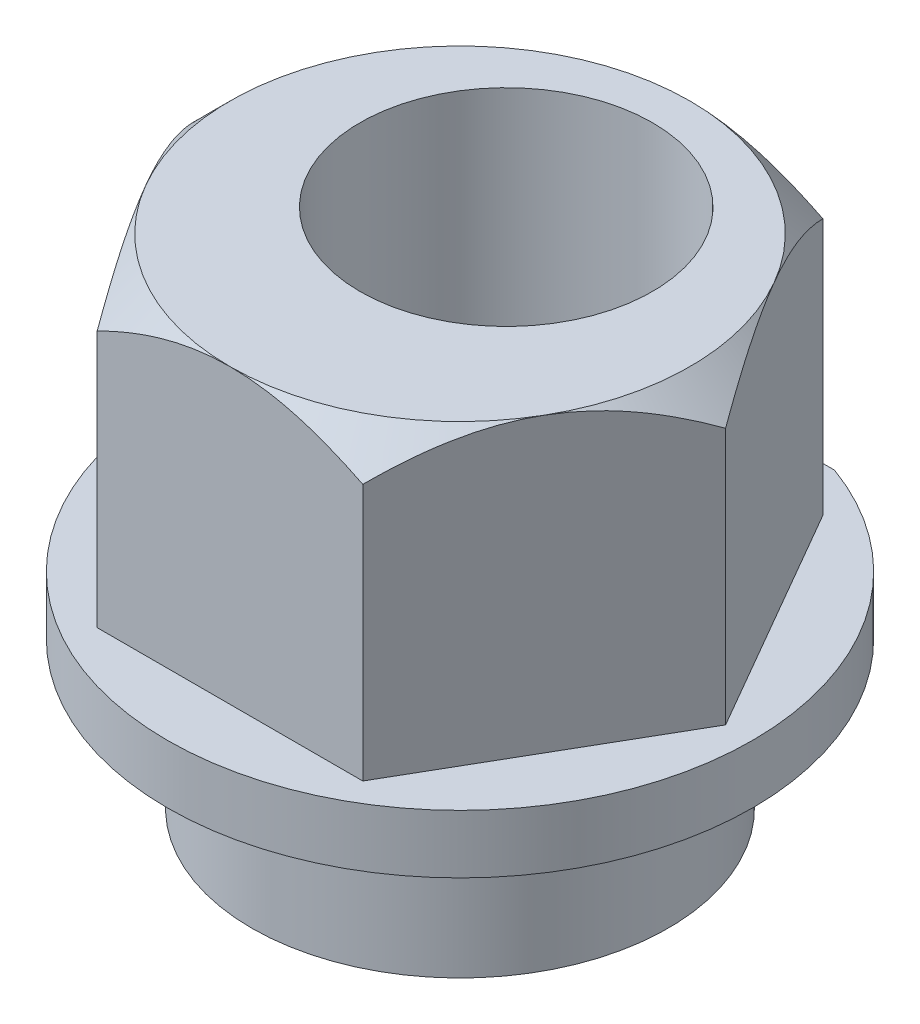
ISO-10303-21;
HEADER;
FILE_DESCRIPTION(('STEP AP214'),'2;1');
FILE_NAME('part.step','',(''),(''),'','','');
FILE_SCHEMA(('AUTOMOTIVE_DESIGN { 1 0 10303 214 1 1 1 1 }'));
ENDSEC;
DATA;
#1=APPLICATION_CONTEXT('core data for automotive mechanical design processes');
#2=APPLICATION_PROTOCOL_DEFINITION('international standard','automotive_design',2000,#1);
#3=PRODUCT_CONTEXT('',#1,'mechanical');
#4=PRODUCT('Part','Part','',(#3));
#5=PRODUCT_RELATED_PRODUCT_CATEGORY('part','',(#4));
#6=PRODUCT_DEFINITION_FORMATION('','',#4);
#7=PRODUCT_DEFINITION_CONTEXT('part definition',#1,'design');
#8=PRODUCT_DEFINITION('design','',#6,#7);
#9=PRODUCT_DEFINITION_SHAPE('','',#8);
#10=(LENGTH_UNIT() NAMED_UNIT(*) SI_UNIT(.MILLI.,.METRE.));
#11=(NAMED_UNIT(*) PLANE_ANGLE_UNIT() SI_UNIT($,.RADIAN.));
#12=(NAMED_UNIT(*) SI_UNIT($,.STERADIAN.) SOLID_ANGLE_UNIT());
#13=UNCERTAINTY_MEASURE_WITH_UNIT(LENGTH_MEASURE(1.E-05),#10,'distance_accuracy_value','');
#14=(GEOMETRIC_REPRESENTATION_CONTEXT(3) GLOBAL_UNCERTAINTY_ASSIGNED_CONTEXT((#13)) GLOBAL_UNIT_ASSIGNED_CONTEXT((#10,
#11,#12)) REPRESENTATION_CONTEXT('',''));
#15=CARTESIAN_POINT('',(0.,0.,0.));
#16=DIRECTION('',(0.,0.,1.));
#17=DIRECTION('',(1.,0.,0.));
#18=AXIS2_PLACEMENT_3D('',#15,#16,#17);
#19=CARTESIAN_POINT('',(-2.27,5.,3.93175533318135));
#20=DIRECTION('',(0.,0.,-1.));
#21=DIRECTION('',(-1.,0.,0.));
#22=AXIS2_PLACEMENT_3D('',#19,#20,#21);
#23=PLANE('',#22);
#24=CARTESIAN_POINT('',(-8.6000228190224,-0.52441156930644,3.93175533318135));
#25=CARTESIAN_POINT('',(-8.47417106777818,-0.409956632713431,3.93175533318135));
#26=CARTESIAN_POINT('',(-8.34810563347453,-0.295736516617883,3.93175533318135));
#27=CARTESIAN_POINT('',(-8.09548697362164,-0.067835354493157,3.93175533318135));
#28=CARTESIAN_POINT('',(-7.96893374476789,0.0458456878724306,3.93175533318135));
#29=CARTESIAN_POINT('',(-7.58838821070913,0.386032807600535,3.93175533318135));
#30=CARTESIAN_POINT('',(-7.33357557116019,0.611623167377675,3.93175533318135));
#31=CARTESIAN_POINT('',(-6.81909396892371,1.06137010956859,3.93175533318135));
#32=CARTESIAN_POINT('',(-6.559402504075,1.28550104064094,3.93175533318135));
#33=CARTESIAN_POINT('',(-6.16703874408497,1.61832234982298,3.93175533318135));
#34=CARTESIAN_POINT('',(-6.03579055665889,1.72869140219158,3.93175533318135));
#35=CARTESIAN_POINT('',(-5.77217570198827,1.94810480433376,3.93175533318135));
#36=CARTESIAN_POINT('',(-5.63980895815953,2.05714906213602,3.93175533318135));
#37=CARTESIAN_POINT('',(-5.27682294674642,2.35257326765163,3.93175533318135));
#38=CARTESIAN_POINT('',(-5.04492002178482,2.53738265563553,3.93175533318135));
#39=CARTESIAN_POINT('',(-4.57603688836875,2.90044445388261,3.93175533318135));
#40=CARTESIAN_POINT('',(-4.33905733460263,3.07869770167396,3.93175533318135));
#41=CARTESIAN_POINT('',(-3.97858782063124,3.33881167671325,3.93175533318135));
#42=CARTESIAN_POINT('',(-3.85768113299005,3.42425020260504,3.93175533318135));
#43=CARTESIAN_POINT('',(-3.6138570073651,3.59220177558191,3.93175533318135));
#44=CARTESIAN_POINT('',(-3.49093969824627,3.67471500908981,3.93175533318135));
#45=CARTESIAN_POINT('',(-3.24282085576494,3.83609884951887,3.93175533318135));
#46=CARTESIAN_POINT('',(-3.11762059941351,3.91497141069697,3.93175533318135));
#47=CARTESIAN_POINT('',(-2.86450980866584,4.06822123349522,3.93175533318135));
#48=CARTESIAN_POINT('',(-2.73659960513852,4.14259903967573,3.93175533318135));
#49=CARTESIAN_POINT('',(-2.48244869682101,4.28304915421703,3.93175533318135));
#50=CARTESIAN_POINT('',(-2.35632351206864,4.34932771771606,3.93175533318135));
#51=CARTESIAN_POINT('',(-2.10086334606727,4.47530499379159,3.93175533318135));
#52=CARTESIAN_POINT('',(-1.97152808762356,4.53500313569987,3.93175533318135));
#53=CARTESIAN_POINT('',(-1.57855460896811,4.70157038256315,3.93175533318135));
#54=CARTESIAN_POINT('',(-1.30928799909616,4.79629643602965,3.93175533318135));
#55=CARTESIAN_POINT('',(-0.921004184798862,4.89504627083465,3.93175533318135));
#56=CARTESIAN_POINT('',(-0.807116545249139,4.91960458592334,3.93175533318135));
#57=CARTESIAN_POINT('',(-0.577700200999931,4.95938872404308,3.93175533318135));
#58=CARTESIAN_POINT('',(-0.462171734875598,4.97461588988773,3.93175533318135));
#59=CARTESIAN_POINT('',(-0.230427594292592,4.99494178849449,3.93175533318135));
#60=CARTESIAN_POINT('',(-0.114213532543297,5.00005871608539,3.93175533318135));
#61=CARTESIAN_POINT('',(0.118212892903144,4.99994026687985,3.93175533318135));
#62=CARTESIAN_POINT('',(0.2344252565134,4.99470467271188,3.93175533318135));
#63=CARTESIAN_POINT('',(0.465576669831557,4.97420007502702,3.93175533318135));
#64=CARTESIAN_POINT('',(0.580518583181538,4.95896283721783,3.93175533318135));
#65=CARTESIAN_POINT('',(0.808800558806269,4.91924835621947,3.93175533318135));
#66=CARTESIAN_POINT('',(0.922140227239552,4.89476888083797,3.93175533318135));
#67=CARTESIAN_POINT('',(1.14699786229447,4.83755907255013,3.93175533318135));
#68=CARTESIAN_POINT('',(1.25851050271048,4.8048080494106,3.93175533318135));
#69=CARTESIAN_POINT('',(1.47918212486924,4.73225313837454,3.93175533318135));
#70=CARTESIAN_POINT('',(1.58834125329539,4.69244969145623,3.93175533318135));
#71=CARTESIAN_POINT('',(1.84761978249406,4.58974204356342,3.93175533318135));
#72=CARTESIAN_POINT('',(1.99660202130106,4.52397664260728,3.93175533318135));
#73=CARTESIAN_POINT('',(2.29027355478252,4.38341308938864,3.93175533318135));
#74=CARTESIAN_POINT('',(2.4349604334732,4.30860996931115,3.93175533318135));
#75=CARTESIAN_POINT('',(2.72080385407516,4.15188493932014,3.93175533318135));
#76=CARTESIAN_POINT('',(2.86195207579064,4.06994796974723,3.93175533318135));
#77=CARTESIAN_POINT('',(3.14091491185587,3.90067575359155,3.93175533318135));
#78=CARTESIAN_POINT('',(3.27873013377743,3.81334150135673,3.93175533318135));
#79=CARTESIAN_POINT('',(3.55298748118888,3.63349193541909,3.93175533318135));
#80=CARTESIAN_POINT('',(3.68940023095779,3.54093203481817,3.93175533318135));
#81=CARTESIAN_POINT('',(3.95982446284388,3.352371777699,3.93175533318135));
#82=CARTESIAN_POINT('',(4.09383586233152,3.25637130313162,3.93175533318135));
#83=CARTESIAN_POINT('',(4.35966651471137,3.06172891512756,3.93175533318135));
#84=CARTESIAN_POINT('',(4.49148827144601,2.96309041174252,3.93175533318135));
#85=CARTESIAN_POINT('',(4.75342283714005,2.7635680512874,3.93175533318135));
#86=CARTESIAN_POINT('',(4.88353560122586,2.66268413544546,3.93175533318135));
#87=CARTESIAN_POINT('',(5.1701453302912,2.43716714719451,3.93175533318135));
#88=CARTESIAN_POINT('',(5.32629592127036,2.3120943632501,3.93175533318135));
#89=CARTESIAN_POINT('',(5.63681960255552,2.05976325431522,3.93175533318135));
#90=CARTESIAN_POINT('',(5.79119267116417,1.93250490269373,3.93175533318135));
#91=CARTESIAN_POINT('',(6.25223154071247,1.54797710224199,3.93175533318135));
#92=CARTESIAN_POINT('',(6.55668696847647,1.28805839421696,3.93175533318135));
#93=CARTESIAN_POINT('',(7.15261464892951,0.771031249651298,3.93175533318135));
#94=CARTESIAN_POINT('',(7.44420710799032,0.514060583881735,3.93175533318135));
#95=CARTESIAN_POINT('',(7.879284428493,0.126215357984937,3.93175533318135));
#96=CARTESIAN_POINT('',(8.02387632548026,-0.00342021657362475,3.93175533318135));
#97=CARTESIAN_POINT('',(8.31241220611582,-0.263406206774195,3.93175533318135));
#98=CARTESIAN_POINT('',(8.45635619954871,-0.393756611554496,3.93175533318135));
#99=CARTESIAN_POINT('',(8.6000228190224,-0.524411569306441,3.93175533318135));
#100=B_SPLINE_CURVE_WITH_KNOTS('',3,(#24,#25,#26,#27,#28,#29,#30,#31,#32,#33,#34,#35,#36,#37,
#38,#39,#40,#41,#42,#43,#44,#45,#46,#47,#48,#49,#50,#51,#52,#53,#54,#55,#56,#57,#58,#59,#60,#61,
#62,#63,#64,#65,#66,#67,#68,#69,#70,#71,#72,#73,#74,#75,#76,#77,#78,#79,#80,#81,#82,#83,#84,#85,
#86,#87,#88,#89,#90,#91,#92,#93,#94,#95,#96,#97,#98,#99),.UNSPECIFIED.,.F.,.F.,(4,2,2,2,2,2,2,2,
2,2,2,2,2,2,2,2,2,2,2,2,2,2,2,2,2,2,2,2,2,2,2,2,2,2,2,2,2,4),(0.,0.510340114774654,
1.02068369290719,2.04163676290728,3.07070538013727,3.58515572785447,4.09964158852796,
4.9891730747215,5.8785905283064,6.32270092984362,6.76678297808562,7.21062380982803,
7.65441075994523,8.08165392177927,8.50893410595085,9.36121192377472,9.7104169009407,
10.0595716134115,10.4080973973259,10.7566304993015,11.1040619647595,11.4515773958677,
11.7999708546058,12.1483425364702,12.636481032208,13.1248890771091,13.6143543887469,
14.1037297928704,14.5982165343626,15.0927202584065,15.5866130208688,16.0805187258154,
16.680689529546,17.2808676515222,18.4817223275855,19.6476860099929,20.2302728035723,
20.812850769251),.UNSPECIFIED.);
#101=CARTESIAN_POINT('',(-2.27,4.39175533318135,3.93175533318135));
#102=VERTEX_POINT('',#101);
#103=CARTESIAN_POINT('',(0.,5.,3.93175533318135));
#104=VERTEX_POINT('',#103);
#105=EDGE_CURVE('E270',#102,#104,#100,.T.);
#106=ORIENTED_EDGE('',*,*,#105,.F.);
#107=DIRECTION('',(0.,-1.,0.));
#108=VECTOR('',#107,1.);
#109=CARTESIAN_POINT('',(-2.27,5.,3.93175533318135));
#110=LINE('',#109,#108);
#111=CARTESIAN_POINT('',(-2.27,0.,3.93175533318135));
#112=VERTEX_POINT('',#111);
#113=EDGE_CURVE('E255',#102,#112,#110,.T.);
#114=ORIENTED_EDGE('',*,*,#113,.T.);
#115=DIRECTION('',(1.,0.,0.));
#116=VECTOR('',#115,1.);
#117=CARTESIAN_POINT('',(-2.27,0.,3.93175533318135));
#118=LINE('',#117,#116);
#119=CARTESIAN_POINT('',(2.27,0.,3.93175533318135));
#120=VERTEX_POINT('',#119);
#121=EDGE_CURVE('E241',#112,#120,#118,.T.);
#122=ORIENTED_EDGE('',*,*,#121,.T.);
#123=DIRECTION('',(0.,-1.,0.));
#124=VECTOR('',#123,1.);
#125=CARTESIAN_POINT('',(2.27,5.,3.93175533318135));
#126=LINE('',#125,#124);
#127=CARTESIAN_POINT('',(2.27,4.39175533318136,3.93175533318135));
#128=VERTEX_POINT('',#127);
#129=EDGE_CURVE('E234',#128,#120,#126,.T.);
#130=ORIENTED_EDGE('',*,*,#129,.F.);
#131=EDGE_CURVE('E184',#104,#128,#100,.T.);
#132=ORIENTED_EDGE('',*,*,#131,.F.);
#133=EDGE_LOOP('',(#106,#114,#122,#130,#132));
#134=FACE_BOUND('',#133,.T.);
#135=ADVANCED_FACE('F42',(#134),#23,.F.);
#136=CARTESIAN_POINT('',(2.27,5.,3.93175533318135));
#137=DIRECTION('',(-0.866025403784439,0.,-0.5));
#138=DIRECTION('',(-0.5,0.,0.866025403784439));
#139=AXIS2_PLACEMENT_3D('',#136,#137,#138);
#140=PLANE('',#139);
#141=CARTESIAN_POINT('',(2.26988452994616,4.39163985872234,3.93195533318135));
#142=CARTESIAN_POINT('',(2.30891779817269,4.43066914607537,3.86434772942754));
#143=CARTESIAN_POINT('',(2.3482497625114,4.46850103601362,3.79622276883141));
#144=CARTESIAN_POINT('',(2.42757261255264,4.54140502992725,3.65883156235882));
#145=CARTESIAN_POINT('',(2.4675638439363,4.57647562653022,3.58956471774506));
#146=CARTESIAN_POINT('',(2.58899032257584,4.67729708736094,3.37924788735722));
#147=CARTESIAN_POINT('',(2.67145757452428,4.73822745605922,3.23641041702193));
#148=CARTESIAN_POINT('',(2.8377271512729,4.84257387561604,2.94842306234035));
#149=CARTESIAN_POINT('',(2.92148747729008,4.88625269544597,2.80334592202006));
#150=CARTESIAN_POINT('',(3.0908576914781,4.95355482963988,2.50998810575759));
#151=CARTESIAN_POINT('',(3.17646239246894,4.97722835735248,2.36171641427471));
#152=CARTESIAN_POINT('',(3.32399861844126,4.9985874545903,2.10617617493368));
#153=CARTESIAN_POINT('',(3.38574005738043,5.00174857485958,1.99923686575862));
#154=CARTESIAN_POINT('',(3.50912272596991,4.99641996417006,1.78553181498822));
#155=CARTESIAN_POINT('',(3.57076391290883,4.98792614894984,1.67876614737116));
#156=CARTESIAN_POINT('',(3.69346222484401,4.95977214735853,1.46624643709649));
#157=CARTESIAN_POINT('',(3.75451861880206,4.94009947200418,1.36049366063421));
#158=CARTESIAN_POINT('',(3.87558279707033,4.89066164453293,1.15080435289699));
#159=CARTESIAN_POINT('',(3.93559066140872,4.86089726622646,1.04686768300919));
#160=CARTESIAN_POINT('',(4.04211925292121,4.79966000814883,0.862354750050812));
#161=CARTESIAN_POINT('',(4.08887583057235,4.76979718890661,0.781369981970992));
#162=CARTESIAN_POINT('',(4.181549617169,4.7052589145889,0.620854275055807));
#163=CARTESIAN_POINT('',(4.227466800528,4.67058331308562,0.54132338053756));
#164=CARTESIAN_POINT('',(4.31831713258542,4.59719681770693,0.383965989529596));
#165=CARTESIAN_POINT('',(4.363252865234,4.55849861315991,0.30613501750693));
#166=CARTESIAN_POINT('',(4.45229216959135,4.4775750802213,0.151914418489406));
#167=CARTESIAN_POINT('',(4.49639623177315,4.43535191582271,0.0755239419703531));
#168=CARTESIAN_POINT('',(4.54011547005384,4.39163985872235,-0.000200000000002201));
#169=B_SPLINE_CURVE_WITH_KNOTS('',3,(#141,#142,#143,#144,#145,#146,#147,#148,#149,#150,#151,
#152,#153,#154,#155,#156,#157,#158,#159,#160,#161,#162,#163,#164,#165,#166,#167,#168),
.UNSPECIFIED.,.F.,.F.,(4,2,2,2,2,2,2,2,2,2,2,2,2,4),(0.,0.261817982395265,0.523777912649391,
1.05052627551642,1.56890964841258,2.08598797962916,2.45603524911659,2.82621222810196,
3.19680358288644,3.56736652793413,3.86172547652692,4.15609338288718,4.44955936991257,
4.74284650296531),.UNSPECIFIED.);
#170=CARTESIAN_POINT('',(3.405,5.,1.96587766659067));
#171=VERTEX_POINT('',#170);
#172=EDGE_CURVE('E231',#128,#171,#169,.T.);
#173=ORIENTED_EDGE('',*,*,#172,.F.);
#174=ORIENTED_EDGE('',*,*,#129,.T.);
#175=DIRECTION('',(0.5,0.,-0.866025403784439));
#176=VECTOR('',#175,1.);
#177=CARTESIAN_POINT('',(2.27,0.,3.93175533318135));
#178=LINE('',#177,#176);
#179=CARTESIAN_POINT('',(4.54,0.,0.));
#180=VERTEX_POINT('',#179);
#181=EDGE_CURVE('E269',#120,#180,#178,.T.);
#182=ORIENTED_EDGE('',*,*,#181,.T.);
#183=DIRECTION('',(0.,-1.,0.));
#184=VECTOR('',#183,1.);
#185=CARTESIAN_POINT('',(4.54,5.,0.));
#186=LINE('',#185,#184);
#187=CARTESIAN_POINT('',(4.54,4.39175533318136,0.));
#188=VERTEX_POINT('',#187);
#189=EDGE_CURVE('E242',#188,#180,#186,.T.);
#190=ORIENTED_EDGE('',*,*,#189,.F.);
#191=EDGE_CURVE('E209',#171,#188,#169,.T.);
#192=ORIENTED_EDGE('',*,*,#191,.F.);
#193=EDGE_LOOP('',(#173,#174,#182,#190,#192));
#194=FACE_BOUND('',#193,.T.);
#195=ADVANCED_FACE('F218',(#194),#140,.F.);
#196=CARTESIAN_POINT('',(4.54,5.,0.));
#197=DIRECTION('',(-0.866025403784438,0.,0.5));
#198=DIRECTION('',(0.5,0.,0.866025403784438));
#199=AXIS2_PLACEMENT_3D('',#196,#197,#198);
#200=PLANE('',#199);
#201=CARTESIAN_POINT('',(4.54011547005384,4.39163985872235,0.000199999999997449));
#202=CARTESIAN_POINT('',(4.50108220182731,4.43066914607537,-0.0674076037538108));
#203=CARTESIAN_POINT('',(4.4617502374886,4.46850103601362,-0.135532564349939));
#204=CARTESIAN_POINT('',(4.38242738744736,4.54140502992725,-0.272923770822536));
#205=CARTESIAN_POINT('',(4.34243615606369,4.57647562653022,-0.342190615436288));
#206=CARTESIAN_POINT('',(4.22100967742416,4.67729708736094,-0.552507445824137));
#207=CARTESIAN_POINT('',(4.13854242547572,4.73822745605922,-0.695344916159422));
#208=CARTESIAN_POINT('',(3.9722728487271,4.84257387561604,-0.983332270841005));
#209=CARTESIAN_POINT('',(3.88851252270992,4.88625269544597,-1.12840941116129));
#210=CARTESIAN_POINT('',(3.7191423085219,4.95355482963988,-1.42176722742376));
#211=CARTESIAN_POINT('',(3.63353760753106,4.97722835735248,-1.57003891890664));
#212=CARTESIAN_POINT('',(3.48600138155874,4.9985874545903,-1.82557915824767));
#213=CARTESIAN_POINT('',(3.42425994261956,5.00174857485958,-1.93251846742273));
#214=CARTESIAN_POINT('',(3.30087727403009,4.99641996417006,-2.14622351819313));
#215=CARTESIAN_POINT('',(3.23923608709117,4.98792614894984,-2.25298918581019));
#216=CARTESIAN_POINT('',(3.11653777515599,4.95977214735853,-2.46550889608486));
#217=CARTESIAN_POINT('',(3.05548138119794,4.94009947200418,-2.57126167254714));
#218=CARTESIAN_POINT('',(2.93441720292967,4.89066164453293,-2.78095098028436));
#219=CARTESIAN_POINT('',(2.87440933859128,4.86089726622646,-2.88488765017216));
#220=CARTESIAN_POINT('',(2.76788074707879,4.79966000814882,-3.06940058313054));
#221=CARTESIAN_POINT('',(2.72112416942764,4.76979718890661,-3.15038535121036));
#222=CARTESIAN_POINT('',(2.628450382831,4.7052589145889,-3.31090105812554));
#223=CARTESIAN_POINT('',(2.582533199472,4.67058331308562,-3.39043195264379));
#224=CARTESIAN_POINT('',(2.49168286741457,4.59719681770693,-3.54778934365175));
#225=CARTESIAN_POINT('',(2.446747134766,4.55849861315991,-3.62562031567442));
#226=CARTESIAN_POINT('',(2.35770783040864,4.4775750802213,-3.77984091469194));
#227=CARTESIAN_POINT('',(2.31360376822684,4.43535191582271,-3.856231391211));
#228=CARTESIAN_POINT('',(2.26988452994616,4.39163985872234,-3.93195533318135));
#229=B_SPLINE_CURVE_WITH_KNOTS('',3,(#201,#202,#203,#204,#205,#206,#207,#208,#209,#210,#211,
#212,#213,#214,#215,#216,#217,#218,#219,#220,#221,#222,#223,#224,#225,#226,#227,#228),
.UNSPECIFIED.,.F.,.F.,(4,2,2,2,2,2,2,2,2,2,2,2,2,4),(0.,0.261817982395265,0.523777912649389,
1.05052627551642,1.56890964841258,2.08598797962916,2.45603524911659,2.82621222810196,
3.19680358288644,3.56736652793412,3.86172547652692,4.15609338288718,4.44955936991257,
4.74284650296531),.UNSPECIFIED.);
#230=CARTESIAN_POINT('',(3.405,5.,-1.96587766659068));
#231=VERTEX_POINT('',#230);
#232=EDGE_CURVE('E207',#188,#231,#229,.T.);
#233=ORIENTED_EDGE('',*,*,#232,.F.);
#234=ORIENTED_EDGE('',*,*,#189,.T.);
#235=DIRECTION('',(-0.5,0.,-0.866025403784439));
#236=VECTOR('',#235,1.);
#237=CARTESIAN_POINT('',(4.54,0.,0.));
#238=LINE('',#237,#236);
#239=CARTESIAN_POINT('',(2.27,0.,-3.93175533318135));
#240=VERTEX_POINT('',#239);
#241=EDGE_CURVE('E266',#180,#240,#238,.T.);
#242=ORIENTED_EDGE('',*,*,#241,.T.);
#243=DIRECTION('',(0.,-1.,0.));
#244=VECTOR('',#243,1.);
#245=CARTESIAN_POINT('',(2.27,5.,-3.93175533318135));
#246=LINE('',#245,#244);
#247=CARTESIAN_POINT('',(2.27000000000118,4.39175533318141,-3.93175533318135));
#248=VERTEX_POINT('',#247);
#249=EDGE_CURVE('E244',#248,#240,#246,.T.);
#250=ORIENTED_EDGE('',*,*,#249,.F.);
#251=EDGE_CURVE('E201',#231,#248,#229,.T.);
#252=ORIENTED_EDGE('',*,*,#251,.F.);
#253=EDGE_LOOP('',(#233,#234,#242,#250,#252));
#254=FACE_BOUND('',#253,.T.);
#255=ADVANCED_FACE('F214',(#254),#200,.F.);
#256=CARTESIAN_POINT('',(2.27,5.,-3.93175533318135));
#257=DIRECTION('',(0.,0.,1.));
#258=DIRECTION('',(1.,0.,0.));
#259=AXIS2_PLACEMENT_3D('',#256,#257,#258);
#260=PLANE('',#259);
#261=CARTESIAN_POINT('',(8.6000228190224,-0.52441156930644,-3.93175533318135));
#262=CARTESIAN_POINT('',(8.47417106777818,-0.40995663271343,-3.93175533318135));
#263=CARTESIAN_POINT('',(8.34810563347453,-0.295736516617882,-3.93175533318135));
#264=CARTESIAN_POINT('',(8.09548697362164,-0.0678353544931565,-3.93175533318135));
#265=CARTESIAN_POINT('',(7.96893374476788,0.0458456878724309,-3.93175533318135));
#266=CARTESIAN_POINT('',(7.58838821070913,0.386032807600534,-3.93175533318135));
#267=CARTESIAN_POINT('',(7.33357557116019,0.611623167377674,-3.93175533318135));
#268=CARTESIAN_POINT('',(6.81909396892371,1.06137010956859,-3.93175533318135));
#269=CARTESIAN_POINT('',(6.559402504075,1.28550104064094,-3.93175533318135));
#270=CARTESIAN_POINT('',(6.16703874408497,1.61832234982298,-3.93175533318135));
#271=CARTESIAN_POINT('',(6.03579055665889,1.72869140219158,-3.93175533318135));
#272=CARTESIAN_POINT('',(5.77217570198827,1.94810480433376,-3.93175533318135));
#273=CARTESIAN_POINT('',(5.63980895815953,2.05714906213602,-3.93175533318135));
#274=CARTESIAN_POINT('',(5.27682294674642,2.35257326765163,-3.93175533318135));
#275=CARTESIAN_POINT('',(5.04492002178482,2.53738265563553,-3.93175533318135));
#276=CARTESIAN_POINT('',(4.57603688836875,2.90044445388261,-3.93175533318135));
#277=CARTESIAN_POINT('',(4.33905733460264,3.07869770167396,-3.93175533318135));
#278=CARTESIAN_POINT('',(3.97858782063124,3.33881167671325,-3.93175533318135));
#279=CARTESIAN_POINT('',(3.85768113299006,3.42425020260504,-3.93175533318135));
#280=CARTESIAN_POINT('',(3.6138570073651,3.59220177558191,-3.93175533318135));
#281=CARTESIAN_POINT('',(3.49093969824627,3.67471500908981,-3.93175533318135));
#282=CARTESIAN_POINT('',(3.24282085576494,3.83609884951887,-3.93175533318135));
#283=CARTESIAN_POINT('',(3.11762059941352,3.91497141069697,-3.93175533318135));
#284=CARTESIAN_POINT('',(2.86450980866584,4.06822123349521,-3.93175533318135));
#285=CARTESIAN_POINT('',(2.73659960513852,4.14259903967573,-3.93175533318135));
#286=CARTESIAN_POINT('',(2.48244869682101,4.28304915421703,-3.93175533318135));
#287=CARTESIAN_POINT('',(2.35632351206865,4.34932771771606,-3.93175533318135));
#288=CARTESIAN_POINT('',(2.10086334606728,4.47530499379159,-3.93175533318135));
#289=CARTESIAN_POINT('',(1.97152808762357,4.53500313569987,-3.93175533318135));
#290=CARTESIAN_POINT('',(1.57855460896811,4.70157038256315,-3.93175533318135));
#291=CARTESIAN_POINT('',(1.30928799909616,4.79629643602964,-3.93175533318135));
#292=CARTESIAN_POINT('',(0.921004184798865,4.89504627083465,-3.93175533318135));
#293=CARTESIAN_POINT('',(0.807116545249142,4.91960458592333,-3.93175533318135));
#294=CARTESIAN_POINT('',(0.577700200999934,4.95938872404308,-3.93175533318135));
#295=CARTESIAN_POINT('',(0.462171734875601,4.97461588988773,-3.93175533318135));
#296=CARTESIAN_POINT('',(0.230427594292595,4.99494178849449,-3.93175533318135));
#297=CARTESIAN_POINT('',(0.1142135325433,5.00005871608539,-3.93175533318135));
#298=CARTESIAN_POINT('',(-0.118212892903142,4.99994026687985,-3.93175533318135));
#299=CARTESIAN_POINT('',(-0.234425256513397,4.99470467271188,-3.93175533318135));
#300=CARTESIAN_POINT('',(-0.465576669831555,4.97420007502703,-3.93175533318135));
#301=CARTESIAN_POINT('',(-0.580518583181536,4.95896283721783,-3.93175533318135));
#302=CARTESIAN_POINT('',(-0.808800558806267,4.91924835621947,-3.93175533318135));
#303=CARTESIAN_POINT('',(-0.92214022723955,4.89476888083797,-3.93175533318135));
#304=CARTESIAN_POINT('',(-1.14699786229447,4.83755907255013,-3.93175533318135));
#305=CARTESIAN_POINT('',(-1.25851050271048,4.8048080494106,-3.93175533318135));
#306=CARTESIAN_POINT('',(-1.47918212486924,4.73225313837454,-3.93175533318135));
#307=CARTESIAN_POINT('',(-1.58834125329539,4.69244969145623,-3.93175533318135));
#308=CARTESIAN_POINT('',(-1.84761978249406,4.58974204356342,-3.93175533318135));
#309=CARTESIAN_POINT('',(-1.99660202130106,4.52397664260728,-3.93175533318135));
#310=CARTESIAN_POINT('',(-2.29027355478252,4.38341308938864,-3.93175533318135));
#311=CARTESIAN_POINT('',(-2.4349604334732,4.30860996931115,-3.93175533318135));
#312=CARTESIAN_POINT('',(-2.72080385407516,4.15188493932014,-3.93175533318135));
#313=CARTESIAN_POINT('',(-2.86195207579064,4.06994796974723,-3.93175533318135));
#314=CARTESIAN_POINT('',(-3.14091491185587,3.90067575359155,-3.93175533318135));
#315=CARTESIAN_POINT('',(-3.27873013377743,3.81334150135673,-3.93175533318135));
#316=CARTESIAN_POINT('',(-3.55298748118888,3.63349193541909,-3.93175533318135));
#317=CARTESIAN_POINT('',(-3.68940023095779,3.54093203481817,-3.93175533318135));
#318=CARTESIAN_POINT('',(-3.95982446284388,3.352371777699,-3.93175533318135));
#319=CARTESIAN_POINT('',(-4.09383586233152,3.25637130313162,-3.93175533318135));
#320=CARTESIAN_POINT('',(-4.35966651471137,3.06172891512757,-3.93175533318135));
#321=CARTESIAN_POINT('',(-4.49148827144601,2.96309041174252,-3.93175533318135));
#322=CARTESIAN_POINT('',(-4.75342283714005,2.7635680512874,-3.93175533318135));
#323=CARTESIAN_POINT('',(-4.88353560122586,2.66268413544546,-3.93175533318135));
#324=CARTESIAN_POINT('',(-5.1701453302912,2.43716714719452,-3.93175533318135));
#325=CARTESIAN_POINT('',(-5.32629592127036,2.3120943632501,-3.93175533318135));
#326=CARTESIAN_POINT('',(-5.63681960255552,2.05976325431523,-3.93175533318135));
#327=CARTESIAN_POINT('',(-5.79119267116417,1.93250490269373,-3.93175533318135));
#328=CARTESIAN_POINT('',(-6.25223154071246,1.54797710224199,-3.93175533318135));
#329=CARTESIAN_POINT('',(-6.55668696847647,1.28805839421696,-3.93175533318135));
#330=CARTESIAN_POINT('',(-7.15261464892951,0.771031249651299,-3.93175533318135));
#331=CARTESIAN_POINT('',(-7.44420710799032,0.514060583881735,-3.93175533318135));
#332=CARTESIAN_POINT('',(-7.879284428493,0.126215357984935,-3.93175533318135));
#333=CARTESIAN_POINT('',(-8.02387632548027,-0.00342021657362805,-3.93175533318135));
#334=CARTESIAN_POINT('',(-8.31241220611583,-0.263406206774199,-3.93175533318135));
#335=CARTESIAN_POINT('',(-8.45635619954872,-0.393756611554499,-3.93175533318135));
#336=CARTESIAN_POINT('',(-8.6000228190224,-0.524411569306442,-3.93175533318135));
#337=B_SPLINE_CURVE_WITH_KNOTS('',3,(#261,#262,#263,#264,#265,#266,#267,#268,#269,#270,#271,
#272,#273,#274,#275,#276,#277,#278,#279,#280,#281,#282,#283,#284,#285,#286,#287,#288,#289,#290,
#291,#292,#293,#294,#295,#296,#297,#298,#299,#300,#301,#302,#303,#304,#305,#306,#307,#308,#309,
#310,#311,#312,#313,#314,#315,#316,#317,#318,#319,#320,#321,#322,#323,#324,#325,#326,#327,#328,
#329,#330,#331,#332,#333,#334,#335,#336),.UNSPECIFIED.,.F.,.F.,(4,2,2,2,2,2,2,2,2,2,2,2,2,2,2,2,
2,2,2,2,2,2,2,2,2,2,2,2,2,2,2,2,2,2,2,2,2,4),(0.,0.510340114774654,1.02068369290719,
2.04163676290728,3.07070538013727,3.58515572785447,4.09964158852796,4.9891730747215,
5.8785905283064,6.32270092984361,6.76678297808562,7.21062380982802,7.65441075994522,
8.08165392177926,8.50893410595084,9.36121192377471,9.71041690094069,10.0595716134115,
10.4080973973259,10.7566304993015,11.1040619647595,11.4515773958677,11.7999708546058,
12.1483425364702,12.636481032208,13.1248890771091,13.6143543887469,14.1037297928704,
14.5982165343626,15.0927202584065,15.5866130208688,16.0805187258154,16.6806895295459,
17.2808676515222,18.4817223275855,19.6476860099929,20.2302728035723,20.812850769251),.UNSPECIFIED.);
#338=CARTESIAN_POINT('',(0.,5.,-3.93175533318135));
#339=VERTEX_POINT('',#338);
#340=EDGE_CURVE('E208',#248,#339,#337,.T.);
#341=ORIENTED_EDGE('',*,*,#340,.F.);
#342=ORIENTED_EDGE('',*,*,#249,.T.);
#343=DIRECTION('',(-1.,0.,0.));
#344=VECTOR('',#343,1.);
#345=CARTESIAN_POINT('',(2.27,0.,-3.93175533318135));
#346=LINE('',#345,#344);
#347=CARTESIAN_POINT('',(-2.27,0.,-3.93175533318135));
#348=VERTEX_POINT('',#347);
#349=EDGE_CURVE('E263',#240,#348,#346,.T.);
#350=ORIENTED_EDGE('',*,*,#349,.T.);
#351=DIRECTION('',(0.,-1.,0.));
#352=VECTOR('',#351,1.);
#353=CARTESIAN_POINT('',(-2.27,5.,-3.93175533318135));
#354=LINE('',#353,#352);
#355=CARTESIAN_POINT('',(-2.27,4.39175533318135,-3.93175533318135));
#356=VERTEX_POINT('',#355);
#357=EDGE_CURVE('E249',#356,#348,#354,.T.);
#358=ORIENTED_EDGE('',*,*,#357,.F.);
#359=EDGE_CURVE('E194',#339,#356,#337,.T.);
#360=ORIENTED_EDGE('',*,*,#359,.F.);
#361=EDGE_LOOP('',(#341,#342,#350,#358,#360));
#362=FACE_BOUND('',#361,.T.);
#363=ADVANCED_FACE('F217',(#362),#260,.F.);
#364=CARTESIAN_POINT('',(-2.27,5.,-3.93175533318135));
#365=DIRECTION('',(0.866025403784439,0.,0.499999999999999));
#366=DIRECTION('',(0.499999999999999,0.,-0.866025403784439));
#367=AXIS2_PLACEMENT_3D('',#364,#365,#366);
#368=PLANE('',#367);
#369=CARTESIAN_POINT('',(-2.26988452994616,4.39163985872234,-3.93195533318135));
#370=CARTESIAN_POINT('',(-2.30891779817269,4.43066914607537,-3.86434772942754));
#371=CARTESIAN_POINT('',(-2.3482497625114,4.46850103601361,-3.79622276883142));
#372=CARTESIAN_POINT('',(-2.42757261255264,4.54140502992725,-3.65883156235882));
#373=CARTESIAN_POINT('',(-2.46756384393631,4.57647562653021,-3.58956471774507));
#374=CARTESIAN_POINT('',(-2.58899032257584,4.67729708736093,-3.37924788735722));
#375=CARTESIAN_POINT('',(-2.67145757452428,4.73822745605921,-3.23641041702193));
#376=CARTESIAN_POINT('',(-2.8377271512729,4.84257387561604,-2.94842306234035));
#377=CARTESIAN_POINT('',(-2.92148747729008,4.88625269544597,-2.80334592202006));
#378=CARTESIAN_POINT('',(-3.0908576914781,4.95355482963988,-2.50998810575759));
#379=CARTESIAN_POINT('',(-3.17646239246894,4.97722835735248,-2.36171641427471));
#380=CARTESIAN_POINT('',(-3.32399861844126,4.9985874545903,-2.10617617493368));
#381=CARTESIAN_POINT('',(-3.38574005738044,5.00174857485958,-1.99923686575862));
#382=CARTESIAN_POINT('',(-3.50912272596991,4.99641996417006,-1.78553181498822));
#383=CARTESIAN_POINT('',(-3.57076391290883,4.98792614894984,-1.67876614737116));
#384=CARTESIAN_POINT('',(-3.69346222484401,4.95977214735853,-1.46624643709649));
#385=CARTESIAN_POINT('',(-3.75451861880206,4.94009947200418,-1.36049366063421));
#386=CARTESIAN_POINT('',(-3.87558279707033,4.89066164453293,-1.15080435289699));
#387=CARTESIAN_POINT('',(-3.93559066140872,4.86089726622646,-1.04686768300919));
#388=CARTESIAN_POINT('',(-4.04211925292121,4.79966000814882,-0.862354750050813));
#389=CARTESIAN_POINT('',(-4.08887583057235,4.7697971889066,-0.781369981970993));
#390=CARTESIAN_POINT('',(-4.181549617169,4.7052589145889,-0.620854275055808));
#391=CARTESIAN_POINT('',(-4.227466800528,4.67058331308562,-0.541323380537561));
#392=CARTESIAN_POINT('',(-4.31831713258542,4.59719681770693,-0.383965989529598));
#393=CARTESIAN_POINT('',(-4.363252865234,4.55849861315991,-0.306135017506932));
#394=CARTESIAN_POINT('',(-4.45229216959135,4.4775750802213,-0.151914418489408));
#395=CARTESIAN_POINT('',(-4.49639623177315,4.43535191582271,-0.0755239419703553));
#396=CARTESIAN_POINT('',(-4.54011547005384,4.39163985872234,0.000200000000000562));
#397=B_SPLINE_CURVE_WITH_KNOTS('',3,(#369,#370,#371,#372,#373,#374,#375,#376,#377,#378,#379,
#380,#381,#382,#383,#384,#385,#386,#387,#388,#389,#390,#391,#392,#393,#394,#395,#396),
.UNSPECIFIED.,.F.,.F.,(4,2,2,2,2,2,2,2,2,2,2,2,2,4),(0.,0.261817982395265,0.52377791264939,
1.05052627551642,1.56890964841258,2.08598797962916,2.45603524911659,2.82621222810196,
3.19680358288644,3.56736652793413,3.86172547652692,4.15609338288718,4.44955936991257,
4.74284650296531),.UNSPECIFIED.);
#398=CARTESIAN_POINT('',(-3.405,5.,-1.96587766659067));
#399=VERTEX_POINT('',#398);
#400=EDGE_CURVE('E298',#356,#399,#397,.T.);
#401=ORIENTED_EDGE('',*,*,#400,.F.);
#402=ORIENTED_EDGE('',*,*,#357,.T.);
#403=DIRECTION('',(-0.499999999999999,0.,0.866025403784439));
#404=VECTOR('',#403,1.);
#405=CARTESIAN_POINT('',(-2.27,0.,-3.93175533318135));
#406=LINE('',#405,#404);
#407=CARTESIAN_POINT('',(-4.54,0.,0.));
#408=VERTEX_POINT('',#407);
#409=EDGE_CURVE('E260',#348,#408,#406,.T.);
#410=ORIENTED_EDGE('',*,*,#409,.T.);
#411=DIRECTION('',(0.,-1.,0.));
#412=VECTOR('',#411,1.);
#413=CARTESIAN_POINT('',(-4.54,5.,0.));
#414=LINE('',#413,#412);
#415=CARTESIAN_POINT('',(-4.54,4.39175533318136,0.));
#416=VERTEX_POINT('',#415);
#417=EDGE_CURVE('E252',#416,#408,#414,.T.);
#418=ORIENTED_EDGE('',*,*,#417,.F.);
#419=EDGE_CURVE('E162',#399,#416,#397,.T.);
#420=ORIENTED_EDGE('',*,*,#419,.F.);
#421=EDGE_LOOP('',(#401,#402,#410,#418,#420));
#422=FACE_BOUND('',#421,.T.);
#423=ADVANCED_FACE('F310',(#422),#368,.F.);
#424=CARTESIAN_POINT('',(-4.54,5.,0.));
#425=DIRECTION('',(0.866025403784439,0.,-0.5));
#426=DIRECTION('',(-0.5,0.,-0.866025403784439));
#427=AXIS2_PLACEMENT_3D('',#424,#425,#426);
#428=PLANE('',#427);
#429=CARTESIAN_POINT('',(-4.54011547005384,4.39163985872234,-0.00019999999999952));
#430=CARTESIAN_POINT('',(-4.50108220182731,4.43066914607537,0.0674076037538089));
#431=CARTESIAN_POINT('',(-4.4617502374886,4.46850103601362,0.135532564349937));
#432=CARTESIAN_POINT('',(-4.38242738744736,4.54140502992725,0.272923770822534));
#433=CARTESIAN_POINT('',(-4.3424361560637,4.57647562653021,0.342190615436286));
#434=CARTESIAN_POINT('',(-4.22100967742416,4.67729708736094,0.552507445824134));
#435=CARTESIAN_POINT('',(-4.13854242547572,4.73822745605922,0.69534491615942));
#436=CARTESIAN_POINT('',(-3.9722728487271,4.84257387561604,0.983332270841003));
#437=CARTESIAN_POINT('',(-3.88851252270992,4.88625269544597,1.12840941116129));
#438=CARTESIAN_POINT('',(-3.7191423085219,4.95355482963988,1.42176722742376));
#439=CARTESIAN_POINT('',(-3.63353760753106,4.97722835735248,1.57003891890664));
#440=CARTESIAN_POINT('',(-3.48600138155874,4.9985874545903,1.82557915824767));
#441=CARTESIAN_POINT('',(-3.42425994261957,5.00174857485958,1.93251846742272));
#442=CARTESIAN_POINT('',(-3.30087727403009,4.99641996417006,2.14622351819313));
#443=CARTESIAN_POINT('',(-3.23923608709117,4.98792614894984,2.25298918581018));
#444=CARTESIAN_POINT('',(-3.11653777515599,4.95977214735853,2.46550889608485));
#445=CARTESIAN_POINT('',(-3.05548138119794,4.94009947200418,2.57126167254714));
#446=CARTESIAN_POINT('',(-2.93441720292967,4.89066164453293,2.78095098028436));
#447=CARTESIAN_POINT('',(-2.87440933859128,4.86089726622646,2.88488765017216));
#448=CARTESIAN_POINT('',(-2.76788074707879,4.79966000814882,3.06940058313053));
#449=CARTESIAN_POINT('',(-2.72112416942765,4.76979718890661,3.15038535121035));
#450=CARTESIAN_POINT('',(-2.628450382831,4.7052589145889,3.31090105812554));
#451=CARTESIAN_POINT('',(-2.582533199472,4.67058331308562,3.39043195264379));
#452=CARTESIAN_POINT('',(-2.49168286741457,4.59719681770693,3.54778934365175));
#453=CARTESIAN_POINT('',(-2.446747134766,4.55849861315991,3.62562031567442));
#454=CARTESIAN_POINT('',(-2.35770783040865,4.4775750802213,3.77984091469194));
#455=CARTESIAN_POINT('',(-2.31360376822685,4.43535191582271,3.856231391211));
#456=CARTESIAN_POINT('',(-2.26988452994616,4.39163985872234,3.93195533318135));
#457=B_SPLINE_CURVE_WITH_KNOTS('',3,(#429,#430,#431,#432,#433,#434,#435,#436,#437,#438,#439,
#440,#441,#442,#443,#444,#445,#446,#447,#448,#449,#450,#451,#452,#453,#454,#455,#456),
.UNSPECIFIED.,.F.,.F.,(4,2,2,2,2,2,2,2,2,2,2,2,2,4),(0.,0.261817982395264,0.523777912649389,
1.05052627551642,1.56890964841258,2.08598797962916,2.45603524911659,2.82621222810196,
3.19680358288643,3.56736652793412,3.86172547652692,4.15609338288718,4.44955936991257,
4.74284650296531),.UNSPECIFIED.);
#458=CARTESIAN_POINT('',(-3.405,5.,1.96587766659068));
#459=VERTEX_POINT('',#458);
#460=EDGE_CURVE('E161',#416,#459,#457,.T.);
#461=ORIENTED_EDGE('',*,*,#460,.F.);
#462=ORIENTED_EDGE('',*,*,#417,.T.);
#463=DIRECTION('',(0.5,0.,0.866025403784439));
#464=VECTOR('',#463,1.);
#465=CARTESIAN_POINT('',(-4.54,0.,0.));
#466=LINE('',#465,#464);
#467=EDGE_CURVE('E257',#408,#112,#466,.T.);
#468=ORIENTED_EDGE('',*,*,#467,.T.);
#469=ORIENTED_EDGE('',*,*,#113,.F.);
#470=EDGE_CURVE('E149',#459,#102,#457,.T.);
#471=ORIENTED_EDGE('',*,*,#470,.F.);
#472=EDGE_LOOP('',(#461,#462,#468,#469,#471));
#473=FACE_BOUND('',#472,.T.);
#474=ADVANCED_FACE('F169',(#473),#428,.F.);
#475=CARTESIAN_POINT('',(0.,5.,0.));
#476=DIRECTION('',(0.,-1.,0.));
#477=DIRECTION('',(0.,0.,1.));
#478=AXIS2_PLACEMENT_3D('',#475,#476,#477);
#479=CONICAL_SURFACE('',#478,3.93175533318135,0.78539816339745);
#480=ORIENTED_EDGE('',*,*,#105,.T.);
#481=CARTESIAN_POINT('',(0.,5.,0.));
#482=DIRECTION('',(0.,1.,0.));
#483=DIRECTION('',(0.,0.,1.));
#484=AXIS2_PLACEMENT_3D('',#481,#482,#483);
#485=CIRCLE('',#484,3.93175533318135);
#486=EDGE_CURVE('E46',#459,#104,#485,.T.);
#487=ORIENTED_EDGE('',*,*,#486,.F.);
#488=ORIENTED_EDGE('',*,*,#470,.T.);
#489=EDGE_LOOP('',(#480,#487,#488));
#490=FACE_BOUND('',#489,.T.);
#491=ADVANCED_FACE('F172',(#490),#479,.T.);
#492=ORIENTED_EDGE('',*,*,#419,.T.);
#493=ORIENTED_EDGE('',*,*,#460,.T.);
#494=EDGE_CURVE('E67',#399,#459,#485,.T.);
#495=ORIENTED_EDGE('',*,*,#494,.F.);
#496=EDGE_LOOP('',(#492,#493,#495));
#497=FACE_BOUND('',#496,.T.);
#498=ADVANCED_FACE('F176',(#497),#479,.T.);
#499=ORIENTED_EDGE('',*,*,#359,.T.);
#500=ORIENTED_EDGE('',*,*,#400,.T.);
#501=EDGE_CURVE('E452',#339,#399,#485,.T.);
#502=ORIENTED_EDGE('',*,*,#501,.F.);
#503=EDGE_LOOP('',(#499,#500,#502));
#504=FACE_BOUND('',#503,.T.);
#505=ADVANCED_FACE('F283',(#504),#479,.T.);
#506=ORIENTED_EDGE('',*,*,#251,.T.);
#507=ORIENTED_EDGE('',*,*,#340,.T.);
#508=EDGE_CURVE('E451',#231,#339,#485,.T.);
#509=ORIENTED_EDGE('',*,*,#508,.F.);
#510=EDGE_LOOP('',(#506,#507,#509));
#511=FACE_BOUND('',#510,.T.);
#512=ADVANCED_FACE('F278',(#511),#479,.T.);
#513=ORIENTED_EDGE('',*,*,#191,.T.);
#514=ORIENTED_EDGE('',*,*,#232,.T.);
#515=EDGE_CURVE('E51',#171,#231,#485,.T.);
#516=ORIENTED_EDGE('',*,*,#515,.F.);
#517=EDGE_LOOP('',(#513,#514,#516));
#518=FACE_BOUND('',#517,.T.);
#519=ADVANCED_FACE('F272',(#518),#479,.T.);
#520=ORIENTED_EDGE('',*,*,#131,.T.);
#521=ORIENTED_EDGE('',*,*,#172,.T.);
#522=CARTESIAN_POINT('',(0.,5.,0.));
#523=DIRECTION('',(0.,1.,0.));
#524=DIRECTION('',(0.,0.,1.));
#525=AXIS2_PLACEMENT_3D('',#522,#523,#524);
#526=CIRCLE('',#525,3.93175533318135);
#527=EDGE_CURVE('E59',#104,#171,#526,.T.);
#528=ORIENTED_EDGE('',*,*,#527,.F.);
#529=EDGE_LOOP('',(#520,#521,#528));
#530=FACE_BOUND('',#529,.T.);
#531=ADVANCED_FACE('F178',(#530),#479,.T.);
#532=CARTESIAN_POINT('',(0.,5.,0.));
#533=DIRECTION('',(0.,1.,0.));
#534=DIRECTION('',(0.,0.,1.));
#535=AXIS2_PLACEMENT_3D('',#532,#533,#534);
#536=PLANE('',#535);
#537=CARTESIAN_POINT('',(0.,5.00000000000001,-0.79));
#538=DIRECTION('',(0.,-1.,0.));
#539=DIRECTION('',(0.,0.,-1.));
#540=AXIS2_PLACEMENT_3D('',#537,#538,#539);
#541=CIRCLE('',#540,2.5);
#542=CARTESIAN_POINT('',(0.,5.00000000000001,-3.29));
#543=VERTEX_POINT('',#542);
#544=EDGE_CURVE('E436',#543,#543,#541,.T.);
#545=ORIENTED_EDGE('',*,*,#544,.T.);
#546=EDGE_LOOP('',(#545));
#547=FACE_BOUND('',#546,.T.);
#548=ORIENTED_EDGE('',*,*,#486,.T.);
#549=ORIENTED_EDGE('',*,*,#527,.T.);
#550=ORIENTED_EDGE('',*,*,#515,.T.);
#551=ORIENTED_EDGE('',*,*,#508,.T.);
#552=ORIENTED_EDGE('',*,*,#501,.T.);
#553=ORIENTED_EDGE('',*,*,#494,.T.);
#554=EDGE_LOOP('',(#548,#549,#550,#551,#552,#553));
#555=FACE_BOUND('',#554,.T.);
#556=ADVANCED_FACE('F180',(#547,#555),#536,.T.);
#557=CARTESIAN_POINT('',(0.,-1.,0.));
#558=DIRECTION('',(0.,1.,0.));
#559=DIRECTION('',(0.,0.,1.));
#560=AXIS2_PLACEMENT_3D('',#557,#558,#559);
#561=CYLINDRICAL_SURFACE('',#560,5.);
#562=CARTESIAN_POINT('',(0.,0.,0.));
#563=DIRECTION('',(0.,-1.,0.));
#564=DIRECTION('',(0.,0.,-1.));
#565=AXIS2_PLACEMENT_3D('',#562,#563,#564);
#566=CIRCLE('',#565,5.);
#567=CARTESIAN_POINT('',(1.7,0.,-4.7021271782035));
#568=VERTEX_POINT('',#567);
#569=CARTESIAN_POINT('',(-1.7,0.,-4.7021271782035));
#570=VERTEX_POINT('',#569);
#571=EDGE_CURVE('E147',#568,#570,#566,.T.);
#572=ORIENTED_EDGE('',*,*,#571,.T.);
#573=DIRECTION('',(0.,1.,0.));
#574=VECTOR('',#573,1.);
#575=CARTESIAN_POINT('',(-1.7,-1.,-4.7021271782035));
#576=LINE('',#575,#574);
#577=CARTESIAN_POINT('',(-1.7,-1.,-4.7021271782035));
#578=VERTEX_POINT('',#577);
#579=EDGE_CURVE('E133',#578,#570,#576,.T.);
#580=ORIENTED_EDGE('',*,*,#579,.F.);
#581=CARTESIAN_POINT('',(0.,-1.,0.));
#582=DIRECTION('',(0.,-1.,0.));
#583=DIRECTION('',(0.,0.,-1.));
#584=AXIS2_PLACEMENT_3D('',#581,#582,#583);
#585=CIRCLE('',#584,5.);
#586=CARTESIAN_POINT('',(1.7,-1.,-4.7021271782035));
#587=VERTEX_POINT('',#586);
#588=EDGE_CURVE('E139',#587,#578,#585,.T.);
#589=ORIENTED_EDGE('',*,*,#588,.F.);
#590=DIRECTION('',(0.,1.,0.));
#591=VECTOR('',#590,1.);
#592=CARTESIAN_POINT('',(1.7,-1.,-4.7021271782035));
#593=LINE('',#592,#591);
#594=EDGE_CURVE('E136',#587,#568,#593,.T.);
#595=ORIENTED_EDGE('',*,*,#594,.T.);
#596=EDGE_LOOP('',(#572,#580,#589,#595));
#597=FACE_BOUND('',#596,.T.);
#598=ADVANCED_FACE('F145',(#597),#561,.T.);
#599=CARTESIAN_POINT('',(-1.7,-1.,-4.7021271782035));
#600=DIRECTION('',(0.,0.,1.));
#601=DIRECTION('',(1.,0.,0.));
#602=AXIS2_PLACEMENT_3D('',#599,#600,#601);
#603=PLANE('',#602);
#604=DIRECTION('',(1.,0.,0.));
#605=VECTOR('',#604,1.);
#606=CARTESIAN_POINT('',(-1.7,0.,-4.7021271782035));
#607=LINE('',#606,#605);
#608=EDGE_CURVE('E143',#570,#568,#607,.T.);
#609=ORIENTED_EDGE('',*,*,#608,.T.);
#610=ORIENTED_EDGE('',*,*,#594,.F.);
#611=DIRECTION('',(1.,0.,0.));
#612=VECTOR('',#611,1.);
#613=CARTESIAN_POINT('',(-1.7,-1.,-4.7021271782035));
#614=LINE('',#613,#612);
#615=EDGE_CURVE('E129',#578,#587,#614,.T.);
#616=ORIENTED_EDGE('',*,*,#615,.F.);
#617=ORIENTED_EDGE('',*,*,#579,.T.);
#618=EDGE_LOOP('',(#609,#610,#616,#617));
#619=FACE_BOUND('',#618,.T.);
#620=ADVANCED_FACE('F131',(#619),#603,.F.);
#621=CARTESIAN_POINT('',(0.,-1.,0.));
#622=DIRECTION('',(0.,-1.,0.));
#623=DIRECTION('',(0.,0.,-1.));
#624=AXIS2_PLACEMENT_3D('',#621,#622,#623);
#625=PLANE('',#624);
#626=CARTESIAN_POINT('',(0.,-1.,0.));
#627=DIRECTION('',(0.,-1.,0.));
#628=DIRECTION('',(0.,0.,-1.));
#629=AXIS2_PLACEMENT_3D('',#626,#627,#628);
#630=CIRCLE('',#629,3.56);
#631=CARTESIAN_POINT('',(0.,-1.,-3.56));
#632=VERTEX_POINT('',#631);
#633=EDGE_CURVE('E12',#632,#632,#630,.T.);
#634=ORIENTED_EDGE('',*,*,#633,.F.);
#635=EDGE_LOOP('',(#634));
#636=FACE_BOUND('',#635,.T.);
#637=ORIENTED_EDGE('',*,*,#588,.T.);
#638=ORIENTED_EDGE('',*,*,#615,.T.);
#639=EDGE_LOOP('',(#637,#638));
#640=FACE_BOUND('',#639,.T.);
#641=ADVANCED_FACE('F141',(#636,#640),#625,.T.);
#642=CARTESIAN_POINT('',(0.,0.,0.));
#643=DIRECTION('',(0.,-1.,0.));
#644=DIRECTION('',(0.,0.,-1.));
#645=AXIS2_PLACEMENT_3D('',#642,#643,#644);
#646=PLANE('',#645);
#647=ORIENTED_EDGE('',*,*,#121,.F.);
#648=ORIENTED_EDGE('',*,*,#467,.F.);
#649=ORIENTED_EDGE('',*,*,#409,.F.);
#650=ORIENTED_EDGE('',*,*,#349,.F.);
#651=ORIENTED_EDGE('',*,*,#241,.F.);
#652=ORIENTED_EDGE('',*,*,#181,.F.);
#653=EDGE_LOOP('',(#647,#648,#649,#650,#651,#652));
#654=FACE_BOUND('',#653,.T.);
#655=ORIENTED_EDGE('',*,*,#571,.F.);
#656=ORIENTED_EDGE('',*,*,#608,.F.);
#657=EDGE_LOOP('',(#655,#656));
#658=FACE_BOUND('',#657,.T.);
#659=ADVANCED_FACE('F291',(#654,#658),#646,.F.);
#660=CARTESIAN_POINT('',(0.,-3.5,0.));
#661=DIRECTION('',(0.,1.,0.));
#662=DIRECTION('',(0.,0.,1.));
#663=AXIS2_PLACEMENT_3D('',#660,#661,#662);
#664=CYLINDRICAL_SURFACE('',#663,3.56);
#665=CARTESIAN_POINT('',(0.,-3.5,0.));
#666=DIRECTION('',(0.,-1.,0.));
#667=DIRECTION('',(0.,0.,-1.));
#668=AXIS2_PLACEMENT_3D('',#665,#666,#667);
#669=CIRCLE('',#668,3.56);
#670=CARTESIAN_POINT('',(0.,-3.5,-3.56));
#671=VERTEX_POINT('',#670);
#672=EDGE_CURVE('E441',#671,#671,#669,.T.);
#673=ORIENTED_EDGE('',*,*,#672,.F.);
#674=EDGE_LOOP('',(#673));
#675=FACE_BOUND('',#674,.T.);
#676=ORIENTED_EDGE('',*,*,#633,.T.);
#677=EDGE_LOOP('',(#676));
#678=FACE_BOUND('',#677,.T.);
#679=ADVANCED_FACE('F402',(#675,#678),#664,.T.);
#680=CARTESIAN_POINT('',(0.,-3.5,0.));
#681=DIRECTION('',(0.,-1.,0.));
#682=DIRECTION('',(0.,0.,-1.));
#683=AXIS2_PLACEMENT_3D('',#680,#681,#682);
#684=PLANE('',#683);
#685=CARTESIAN_POINT('',(0.,-3.5,-0.79));
#686=DIRECTION('',(0.,-1.,0.));
#687=DIRECTION('',(0.,0.,-1.));
#688=AXIS2_PLACEMENT_3D('',#685,#686,#687);
#689=CIRCLE('',#688,2.5);
#690=CARTESIAN_POINT('',(0.,-3.5,-3.29));
#691=VERTEX_POINT('',#690);
#692=EDGE_CURVE('E439',#691,#691,#689,.T.);
#693=ORIENTED_EDGE('',*,*,#692,.F.);
#694=EDGE_LOOP('',(#693));
#695=FACE_BOUND('',#694,.T.);
#696=ORIENTED_EDGE('',*,*,#672,.T.);
#697=EDGE_LOOP('',(#696));
#698=FACE_BOUND('',#697,.T.);
#699=ADVANCED_FACE('F410',(#695,#698),#684,.T.);
#700=CARTESIAN_POINT('',(0.,5.00000000000001,-0.79));
#701=DIRECTION('',(0.,-1.,0.));
#702=DIRECTION('',(0.,0.,-1.));
#703=AXIS2_PLACEMENT_3D('',#700,#701,#702);
#704=CYLINDRICAL_SURFACE('',#703,2.5);
#705=ORIENTED_EDGE('',*,*,#544,.F.);
#706=EDGE_LOOP('',(#705));
#707=FACE_BOUND('',#706,.T.);
#708=ORIENTED_EDGE('',*,*,#692,.T.);
#709=EDGE_LOOP('',(#708));
#710=FACE_BOUND('',#709,.T.);
#711=ADVANCED_FACE('F420',(#707,#710),#704,.F.);
#712=CLOSED_SHELL('',(#135,#195,#255,#363,#423,#474,#491,#498,#505,#512,#519,#531,#556,#598,
#620,#641,#659,#679,#699,#711));
#713=MANIFOLD_SOLID_BREP('B2',#712);
#714=ADVANCED_BREP_SHAPE_REPRESENTATION('',(#18,#713),#14);
#715=SHAPE_DEFINITION_REPRESENTATION(#9,#714);
ENDSEC;
END-ISO-10303-21;
